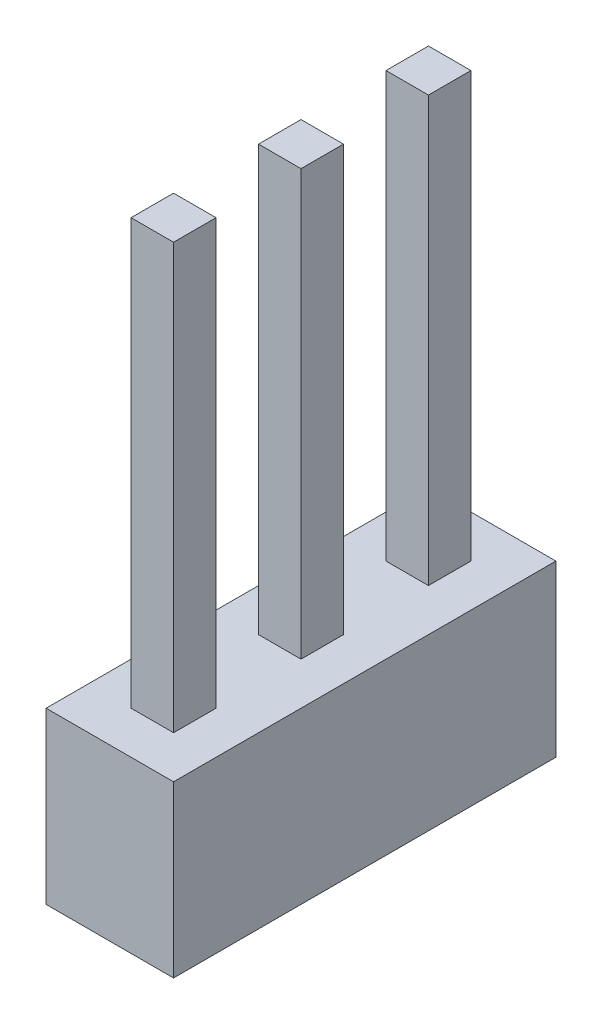
ISO-10303-21;
HEADER;
FILE_DESCRIPTION(('STEP AP214'),'2;1');
FILE_NAME('part.step','',(''),(''),'','','');
FILE_SCHEMA(('AUTOMOTIVE_DESIGN { 1 0 10303 214 1 1 1 1 }'));
ENDSEC;
DATA;
#1=APPLICATION_CONTEXT('core data for automotive mechanical design processes');
#2=APPLICATION_PROTOCOL_DEFINITION('international standard','automotive_design',2000,#1);
#3=PRODUCT_CONTEXT('',#1,'mechanical');
#4=PRODUCT('Part','Part','',(#3));
#5=PRODUCT_RELATED_PRODUCT_CATEGORY('part','',(#4));
#6=PRODUCT_DEFINITION_FORMATION('','',#4);
#7=PRODUCT_DEFINITION_CONTEXT('part definition',#1,'design');
#8=PRODUCT_DEFINITION('design','',#6,#7);
#9=PRODUCT_DEFINITION_SHAPE('','',#8);
#10=(LENGTH_UNIT() NAMED_UNIT(*) SI_UNIT(.MILLI.,.METRE.));
#11=(NAMED_UNIT(*) PLANE_ANGLE_UNIT() SI_UNIT($,.RADIAN.));
#12=(NAMED_UNIT(*) SI_UNIT($,.STERADIAN.) SOLID_ANGLE_UNIT());
#13=UNCERTAINTY_MEASURE_WITH_UNIT(LENGTH_MEASURE(1.E-05),#10,'distance_accuracy_value','');
#14=(GEOMETRIC_REPRESENTATION_CONTEXT(3) GLOBAL_UNCERTAINTY_ASSIGNED_CONTEXT((#13)) GLOBAL_UNIT_ASSIGNED_CONTEXT((#10,
#11,#12)) REPRESENTATION_CONTEXT('',''));
#15=CARTESIAN_POINT('',(0.,0.,0.));
#16=DIRECTION('',(0.,0.,1.));
#17=DIRECTION('',(1.,0.,0.));
#18=AXIS2_PLACEMENT_3D('',#15,#16,#17);
#19=CARTESIAN_POINT('',(0.,3.048,-6.858));
#20=DIRECTION('',(0.,-1.,0.));
#21=DIRECTION('',(0.,0.,-1.));
#22=AXIS2_PLACEMENT_3D('',#19,#20,#21);
#23=PLANE('',#22);
#24=DIRECTION('',(0.,0.,1.));
#25=VECTOR('',#24,1.);
#26=CARTESIAN_POINT('',(0.761999999999999,3.048,-5.334));
#27=LINE('',#26,#25);
#28=CARTESIAN_POINT('',(0.761999999999999,3.048,-6.096));
#29=VERTEX_POINT('',#28);
#30=CARTESIAN_POINT('',(0.761999999999999,3.048,-5.334));
#31=VERTEX_POINT('',#30);
#32=EDGE_CURVE('E170',#29,#31,#27,.T.);
#33=ORIENTED_EDGE('',*,*,#32,.F.);
#34=DIRECTION('',(-1.,0.,0.));
#35=VECTOR('',#34,1.);
#36=CARTESIAN_POINT('',(0.761999999999999,3.048,-6.096));
#37=LINE('',#36,#35);
#38=CARTESIAN_POINT('',(1.524,3.048,-6.096));
#39=VERTEX_POINT('',#38);
#40=EDGE_CURVE('E183',#39,#29,#37,.T.);
#41=ORIENTED_EDGE('',*,*,#40,.F.);
#42=DIRECTION('',(0.,0.,-1.));
#43=VECTOR('',#42,1.);
#44=CARTESIAN_POINT('',(1.524,3.048,-5.334));
#45=LINE('',#44,#43);
#46=CARTESIAN_POINT('',(1.524,3.048,-5.334));
#47=VERTEX_POINT('',#46);
#48=EDGE_CURVE('E192',#47,#39,#45,.T.);
#49=ORIENTED_EDGE('',*,*,#48,.F.);
#50=DIRECTION('',(1.,0.,0.));
#51=VECTOR('',#50,1.);
#52=CARTESIAN_POINT('',(0.761999999999999,3.048,-5.334));
#53=LINE('',#52,#51);
#54=EDGE_CURVE('E173',#31,#47,#53,.T.);
#55=ORIENTED_EDGE('',*,*,#54,.F.);
#56=EDGE_LOOP('',(#33,#41,#49,#55));
#57=FACE_BOUND('',#56,.T.);
#58=DIRECTION('',(0.,0.,1.));
#59=VECTOR('',#58,1.);
#60=CARTESIAN_POINT('',(0.,3.048,0.));
#61=LINE('',#60,#59);
#62=CARTESIAN_POINT('',(0.,3.048,-6.858));
#63=VERTEX_POINT('',#62);
#64=CARTESIAN_POINT('',(0.,3.048,0.));
#65=VERTEX_POINT('',#64);
#66=EDGE_CURVE('E242',#63,#65,#61,.T.);
#67=ORIENTED_EDGE('',*,*,#66,.T.);
#68=DIRECTION('',(1.,0.,0.));
#69=VECTOR('',#68,1.);
#70=CARTESIAN_POINT('',(0.,3.048,0.));
#71=LINE('',#70,#69);
#72=CARTESIAN_POINT('',(2.286,3.048,0.));
#73=VERTEX_POINT('',#72);
#74=EDGE_CURVE('E245',#65,#73,#71,.T.);
#75=ORIENTED_EDGE('',*,*,#74,.T.);
#76=DIRECTION('',(0.,0.,-1.));
#77=VECTOR('',#76,1.);
#78=CARTESIAN_POINT('',(2.286,3.048,0.));
#79=LINE('',#78,#77);
#80=CARTESIAN_POINT('',(2.286,3.048,-6.858));
#81=VERTEX_POINT('',#80);
#82=EDGE_CURVE('E248',#73,#81,#79,.T.);
#83=ORIENTED_EDGE('',*,*,#82,.T.);
#84=DIRECTION('',(-1.,0.,0.));
#85=VECTOR('',#84,1.);
#86=CARTESIAN_POINT('',(0.,3.048,-6.858));
#87=LINE('',#86,#85);
#88=EDGE_CURVE('E250',#81,#63,#87,.T.);
#89=ORIENTED_EDGE('',*,*,#88,.T.);
#90=EDGE_LOOP('',(#67,#75,#83,#89));
#91=FACE_BOUND('',#90,.T.);
#92=DIRECTION('',(0.,0.,1.));
#93=VECTOR('',#92,1.);
#94=CARTESIAN_POINT('',(0.761999999999999,3.048,-0.762));
#95=LINE('',#94,#93);
#96=CARTESIAN_POINT('',(0.761999999999999,3.048,-1.524));
#97=VERTEX_POINT('',#96);
#98=CARTESIAN_POINT('',(0.761999999999999,3.048,-0.762));
#99=VERTEX_POINT('',#98);
#100=EDGE_CURVE('E208',#97,#99,#95,.T.);
#101=ORIENTED_EDGE('',*,*,#100,.F.);
#102=DIRECTION('',(-1.,0.,0.));
#103=VECTOR('',#102,1.);
#104=CARTESIAN_POINT('',(0.761999999999999,3.048,-1.524));
#105=LINE('',#104,#103);
#106=CARTESIAN_POINT('',(1.524,3.048,-1.524));
#107=VERTEX_POINT('',#106);
#108=EDGE_CURVE('E213',#107,#97,#105,.T.);
#109=ORIENTED_EDGE('',*,*,#108,.F.);
#110=DIRECTION('',(0.,0.,-1.));
#111=VECTOR('',#110,1.);
#112=CARTESIAN_POINT('',(1.524,3.048,-0.762));
#113=LINE('',#112,#111);
#114=CARTESIAN_POINT('',(1.524,3.048,-0.762));
#115=VERTEX_POINT('',#114);
#116=EDGE_CURVE('E225',#115,#107,#113,.T.);
#117=ORIENTED_EDGE('',*,*,#116,.F.);
#118=DIRECTION('',(1.,0.,0.));
#119=VECTOR('',#118,1.);
#120=CARTESIAN_POINT('',(0.761999999999999,3.048,-0.762));
#121=LINE('',#120,#119);
#122=EDGE_CURVE('E222',#99,#115,#121,.T.);
#123=ORIENTED_EDGE('',*,*,#122,.F.);
#124=EDGE_LOOP('',(#101,#109,#117,#123));
#125=FACE_BOUND('',#124,.T.);
#126=DIRECTION('',(0.,0.,1.));
#127=VECTOR('',#126,1.);
#128=CARTESIAN_POINT('',(0.761999999999998,3.048,-3.048));
#129=LINE('',#128,#127);
#130=CARTESIAN_POINT('',(0.761999999999998,3.048,-3.81));
#131=VERTEX_POINT('',#130);
#132=CARTESIAN_POINT('',(0.761999999999998,3.048,-3.048));
#133=VERTEX_POINT('',#132);
#134=EDGE_CURVE('E169',#131,#133,#129,.T.);
#135=ORIENTED_EDGE('',*,*,#134,.F.);
#136=DIRECTION('',(-1.,0.,0.));
#137=VECTOR('',#136,1.);
#138=CARTESIAN_POINT('',(0.761999999999998,3.048,-3.81));
#139=LINE('',#138,#137);
#140=CARTESIAN_POINT('',(1.524,3.048,-3.81));
#141=VERTEX_POINT('',#140);
#142=EDGE_CURVE('E166',#141,#131,#139,.T.);
#143=ORIENTED_EDGE('',*,*,#142,.F.);
#144=DIRECTION('',(0.,0.,-1.));
#145=VECTOR('',#144,1.);
#146=CARTESIAN_POINT('',(1.524,3.048,-3.048));
#147=LINE('',#146,#145);
#148=CARTESIAN_POINT('',(1.524,3.048,-3.048));
#149=VERTEX_POINT('',#148);
#150=EDGE_CURVE('E56',#149,#141,#147,.T.);
#151=ORIENTED_EDGE('',*,*,#150,.F.);
#152=DIRECTION('',(1.,0.,0.));
#153=VECTOR('',#152,1.);
#154=CARTESIAN_POINT('',(0.761999999999998,3.048,-3.048));
#155=LINE('',#154,#153);
#156=EDGE_CURVE('E51',#133,#149,#155,.T.);
#157=ORIENTED_EDGE('',*,*,#156,.F.);
#158=EDGE_LOOP('',(#135,#143,#151,#157));
#159=FACE_BOUND('',#158,.T.);
#160=ADVANCED_FACE('F36',(#57,#91,#125,#159),#23,.F.);
#161=CARTESIAN_POINT('',(0.,3.048,0.));
#162=DIRECTION('',(1.,0.,0.));
#163=DIRECTION('',(0.,0.,-1.));
#164=AXIS2_PLACEMENT_3D('',#161,#162,#163);
#165=PLANE('',#164);
#166=DIRECTION('',(0.,0.,1.));
#167=VECTOR('',#166,1.);
#168=CARTESIAN_POINT('',(0.,0.,0.));
#169=LINE('',#168,#167);
#170=CARTESIAN_POINT('',(0.,0.,-6.858));
#171=VERTEX_POINT('',#170);
#172=CARTESIAN_POINT('',(0.,0.,0.));
#173=VERTEX_POINT('',#172);
#174=EDGE_CURVE('E241',#171,#173,#169,.T.);
#175=ORIENTED_EDGE('',*,*,#174,.T.);
#176=DIRECTION('',(0.,-1.,0.));
#177=VECTOR('',#176,1.);
#178=CARTESIAN_POINT('',(0.,3.048,0.));
#179=LINE('',#178,#177);
#180=EDGE_CURVE('E11',#65,#173,#179,.T.);
#181=ORIENTED_EDGE('',*,*,#180,.F.);
#182=ORIENTED_EDGE('',*,*,#66,.F.);
#183=DIRECTION('',(0.,-1.,0.));
#184=VECTOR('',#183,1.);
#185=CARTESIAN_POINT('',(0.,3.048,-6.858));
#186=LINE('',#185,#184);
#187=EDGE_CURVE('E252',#63,#171,#186,.T.);
#188=ORIENTED_EDGE('',*,*,#187,.T.);
#189=EDGE_LOOP('',(#175,#181,#182,#188));
#190=FACE_BOUND('',#189,.T.);
#191=ADVANCED_FACE('F38',(#190),#165,.F.);
#192=CARTESIAN_POINT('',(0.,3.048,0.));
#193=DIRECTION('',(0.,0.,-1.));
#194=DIRECTION('',(-1.,0.,0.));
#195=AXIS2_PLACEMENT_3D('',#192,#193,#194);
#196=PLANE('',#195);
#197=DIRECTION('',(1.,0.,0.));
#198=VECTOR('',#197,1.);
#199=CARTESIAN_POINT('',(0.,0.,0.));
#200=LINE('',#199,#198);
#201=CARTESIAN_POINT('',(2.286,0.,0.));
#202=VERTEX_POINT('',#201);
#203=EDGE_CURVE('E255',#173,#202,#200,.T.);
#204=ORIENTED_EDGE('',*,*,#203,.T.);
#205=DIRECTION('',(0.,-1.,0.));
#206=VECTOR('',#205,1.);
#207=CARTESIAN_POINT('',(2.286,3.048,0.));
#208=LINE('',#207,#206);
#209=EDGE_CURVE('E44',#73,#202,#208,.T.);
#210=ORIENTED_EDGE('',*,*,#209,.F.);
#211=ORIENTED_EDGE('',*,*,#74,.F.);
#212=ORIENTED_EDGE('',*,*,#180,.T.);
#213=EDGE_LOOP('',(#204,#210,#211,#212));
#214=FACE_BOUND('',#213,.T.);
#215=ADVANCED_FACE('F285',(#214),#196,.F.);
#216=CARTESIAN_POINT('',(2.286,3.048,0.));
#217=DIRECTION('',(-1.,0.,0.));
#218=DIRECTION('',(0.,0.,1.));
#219=AXIS2_PLACEMENT_3D('',#216,#217,#218);
#220=PLANE('',#219);
#221=DIRECTION('',(0.,0.,-1.));
#222=VECTOR('',#221,1.);
#223=CARTESIAN_POINT('',(2.286,0.,0.));
#224=LINE('',#223,#222);
#225=CARTESIAN_POINT('',(2.286,0.,-6.858));
#226=VERTEX_POINT('',#225);
#227=EDGE_CURVE('E257',#202,#226,#224,.T.);
#228=ORIENTED_EDGE('',*,*,#227,.T.);
#229=DIRECTION('',(0.,-1.,0.));
#230=VECTOR('',#229,1.);
#231=CARTESIAN_POINT('',(2.286,3.048,-6.858));
#232=LINE('',#231,#230);
#233=EDGE_CURVE('E262',#81,#226,#232,.T.);
#234=ORIENTED_EDGE('',*,*,#233,.F.);
#235=ORIENTED_EDGE('',*,*,#82,.F.);
#236=ORIENTED_EDGE('',*,*,#209,.T.);
#237=EDGE_LOOP('',(#228,#234,#235,#236));
#238=FACE_BOUND('',#237,.T.);
#239=ADVANCED_FACE('F269',(#238),#220,.F.);
#240=CARTESIAN_POINT('',(0.,3.048,-6.858));
#241=DIRECTION('',(0.,0.,1.));
#242=DIRECTION('',(1.,0.,0.));
#243=AXIS2_PLACEMENT_3D('',#240,#241,#242);
#244=PLANE('',#243);
#245=DIRECTION('',(-1.,0.,0.));
#246=VECTOR('',#245,1.);
#247=CARTESIAN_POINT('',(0.,0.,-6.858));
#248=LINE('',#247,#246);
#249=EDGE_CURVE('E246',#226,#171,#248,.T.);
#250=ORIENTED_EDGE('',*,*,#249,.T.);
#251=ORIENTED_EDGE('',*,*,#187,.F.);
#252=ORIENTED_EDGE('',*,*,#88,.F.);
#253=ORIENTED_EDGE('',*,*,#233,.T.);
#254=EDGE_LOOP('',(#250,#251,#252,#253));
#255=FACE_BOUND('',#254,.T.);
#256=ADVANCED_FACE('F278',(#255),#244,.F.);
#257=CARTESIAN_POINT('',(0.,0.,-6.858));
#258=DIRECTION('',(0.,-1.,0.));
#259=DIRECTION('',(0.,0.,-1.));
#260=AXIS2_PLACEMENT_3D('',#257,#258,#259);
#261=PLANE('',#260);
#262=ORIENTED_EDGE('',*,*,#174,.F.);
#263=ORIENTED_EDGE('',*,*,#249,.F.);
#264=ORIENTED_EDGE('',*,*,#227,.F.);
#265=ORIENTED_EDGE('',*,*,#203,.F.);
#266=EDGE_LOOP('',(#262,#263,#264,#265));
#267=FACE_BOUND('',#266,.T.);
#268=ADVANCED_FACE('F275',(#267),#261,.T.);
#269=CARTESIAN_POINT('',(0.761999999999999,10.668,-0.762));
#270=DIRECTION('',(1.,0.,0.));
#271=DIRECTION('',(0.,0.,-1.));
#272=AXIS2_PLACEMENT_3D('',#269,#270,#271);
#273=PLANE('',#272);
#274=ORIENTED_EDGE('',*,*,#100,.T.);
#275=DIRECTION('',(0.,-1.,0.));
#276=VECTOR('',#275,1.);
#277=CARTESIAN_POINT('',(0.761999999999999,10.668,-0.762));
#278=LINE('',#277,#276);
#279=CARTESIAN_POINT('',(0.761999999999999,10.668,-0.762));
#280=VERTEX_POINT('',#279);
#281=EDGE_CURVE('E238',#280,#99,#278,.T.);
#282=ORIENTED_EDGE('',*,*,#281,.F.);
#283=DIRECTION('',(0.,0.,1.));
#284=VECTOR('',#283,1.);
#285=CARTESIAN_POINT('',(0.761999999999999,10.668,-0.762));
#286=LINE('',#285,#284);
#287=CARTESIAN_POINT('',(0.761999999999999,10.668,-1.524));
#288=VERTEX_POINT('',#287);
#289=EDGE_CURVE('E209',#288,#280,#286,.T.);
#290=ORIENTED_EDGE('',*,*,#289,.F.);
#291=DIRECTION('',(0.,-1.,0.));
#292=VECTOR('',#291,1.);
#293=CARTESIAN_POINT('',(0.761999999999999,10.668,-1.524));
#294=LINE('',#293,#292);
#295=EDGE_CURVE('E219',#288,#97,#294,.T.);
#296=ORIENTED_EDGE('',*,*,#295,.T.);
#297=EDGE_LOOP('',(#274,#282,#290,#296));
#298=FACE_BOUND('',#297,.T.);
#299=ADVANCED_FACE('F299',(#298),#273,.F.);
#300=CARTESIAN_POINT('',(0.761999999999999,10.668,-0.762));
#301=DIRECTION('',(0.,0.,-1.));
#302=DIRECTION('',(-1.,0.,0.));
#303=AXIS2_PLACEMENT_3D('',#300,#301,#302);
#304=PLANE('',#303);
#305=ORIENTED_EDGE('',*,*,#122,.T.);
#306=DIRECTION('',(0.,-1.,0.));
#307=VECTOR('',#306,1.);
#308=CARTESIAN_POINT('',(1.524,10.668,-0.762));
#309=LINE('',#308,#307);
#310=CARTESIAN_POINT('',(1.524,10.668,-0.762));
#311=VERTEX_POINT('',#310);
#312=EDGE_CURVE('E235',#311,#115,#309,.T.);
#313=ORIENTED_EDGE('',*,*,#312,.F.);
#314=DIRECTION('',(1.,0.,0.));
#315=VECTOR('',#314,1.);
#316=CARTESIAN_POINT('',(0.761999999999999,10.668,-0.762));
#317=LINE('',#316,#315);
#318=EDGE_CURVE('E212',#280,#311,#317,.T.);
#319=ORIENTED_EDGE('',*,*,#318,.F.);
#320=ORIENTED_EDGE('',*,*,#281,.T.);
#321=EDGE_LOOP('',(#305,#313,#319,#320));
#322=FACE_BOUND('',#321,.T.);
#323=ADVANCED_FACE('F318',(#322),#304,.F.);
#324=CARTESIAN_POINT('',(1.524,10.668,-0.762));
#325=DIRECTION('',(-1.,0.,0.));
#326=DIRECTION('',(0.,0.,1.));
#327=AXIS2_PLACEMENT_3D('',#324,#325,#326);
#328=PLANE('',#327);
#329=ORIENTED_EDGE('',*,*,#116,.T.);
#330=DIRECTION('',(0.,-1.,0.));
#331=VECTOR('',#330,1.);
#332=CARTESIAN_POINT('',(1.524,10.668,-1.524));
#333=LINE('',#332,#331);
#334=CARTESIAN_POINT('',(1.524,10.668,-1.524));
#335=VERTEX_POINT('',#334);
#336=EDGE_CURVE('E232',#335,#107,#333,.T.);
#337=ORIENTED_EDGE('',*,*,#336,.F.);
#338=DIRECTION('',(0.,0.,-1.));
#339=VECTOR('',#338,1.);
#340=CARTESIAN_POINT('',(1.524,10.668,-0.762));
#341=LINE('',#340,#339);
#342=EDGE_CURVE('E215',#311,#335,#341,.T.);
#343=ORIENTED_EDGE('',*,*,#342,.F.);
#344=ORIENTED_EDGE('',*,*,#312,.T.);
#345=EDGE_LOOP('',(#329,#337,#343,#344));
#346=FACE_BOUND('',#345,.T.);
#347=ADVANCED_FACE('F325',(#346),#328,.F.);
#348=CARTESIAN_POINT('',(0.761999999999999,10.668,-1.524));
#349=DIRECTION('',(0.,0.,1.));
#350=DIRECTION('',(1.,0.,0.));
#351=AXIS2_PLACEMENT_3D('',#348,#349,#350);
#352=PLANE('',#351);
#353=ORIENTED_EDGE('',*,*,#108,.T.);
#354=ORIENTED_EDGE('',*,*,#295,.F.);
#355=DIRECTION('',(-1.,0.,0.));
#356=VECTOR('',#355,1.);
#357=CARTESIAN_POINT('',(0.761999999999999,10.668,-1.524));
#358=LINE('',#357,#356);
#359=EDGE_CURVE('E217',#335,#288,#358,.T.);
#360=ORIENTED_EDGE('',*,*,#359,.F.);
#361=ORIENTED_EDGE('',*,*,#336,.T.);
#362=EDGE_LOOP('',(#353,#354,#360,#361));
#363=FACE_BOUND('',#362,.T.);
#364=ADVANCED_FACE('F332',(#363),#352,.F.);
#365=CARTESIAN_POINT('',(0.761999999999999,10.668,-1.524));
#366=DIRECTION('',(0.,-1.,0.));
#367=DIRECTION('',(0.,0.,-1.));
#368=AXIS2_PLACEMENT_3D('',#365,#366,#367);
#369=PLANE('',#368);
#370=ORIENTED_EDGE('',*,*,#289,.T.);
#371=ORIENTED_EDGE('',*,*,#318,.T.);
#372=ORIENTED_EDGE('',*,*,#342,.T.);
#373=ORIENTED_EDGE('',*,*,#359,.T.);
#374=EDGE_LOOP('',(#370,#371,#372,#373));
#375=FACE_BOUND('',#374,.T.);
#376=ADVANCED_FACE('F340',(#375),#369,.F.);
#377=CARTESIAN_POINT('',(0.761999999999999,10.668,-5.334));
#378=DIRECTION('',(1.,0.,0.));
#379=DIRECTION('',(0.,0.,-1.));
#380=AXIS2_PLACEMENT_3D('',#377,#378,#379);
#381=PLANE('',#380);
#382=ORIENTED_EDGE('',*,*,#32,.T.);
#383=DIRECTION('',(0.,-1.,0.));
#384=VECTOR('',#383,1.);
#385=CARTESIAN_POINT('',(0.761999999999999,10.668,-5.334));
#386=LINE('',#385,#384);
#387=CARTESIAN_POINT('',(0.761999999999999,10.668,-5.334));
#388=VERTEX_POINT('',#387);
#389=EDGE_CURVE('E205',#388,#31,#386,.T.);
#390=ORIENTED_EDGE('',*,*,#389,.F.);
#391=DIRECTION('',(0.,0.,1.));
#392=VECTOR('',#391,1.);
#393=CARTESIAN_POINT('',(0.761999999999999,10.668,-5.334));
#394=LINE('',#393,#392);
#395=CARTESIAN_POINT('',(0.761999999999999,10.668,-6.096));
#396=VERTEX_POINT('',#395);
#397=EDGE_CURVE('E179',#396,#388,#394,.T.);
#398=ORIENTED_EDGE('',*,*,#397,.F.);
#399=DIRECTION('',(0.,-1.,0.));
#400=VECTOR('',#399,1.);
#401=CARTESIAN_POINT('',(0.761999999999999,10.668,-6.096));
#402=LINE('',#401,#400);
#403=EDGE_CURVE('E188',#396,#29,#402,.T.);
#404=ORIENTED_EDGE('',*,*,#403,.T.);
#405=EDGE_LOOP('',(#382,#390,#398,#404));
#406=FACE_BOUND('',#405,.T.);
#407=ADVANCED_FACE('F348',(#406),#381,.F.);
#408=CARTESIAN_POINT('',(0.761999999999999,10.668,-5.334));
#409=DIRECTION('',(0.,0.,-1.));
#410=DIRECTION('',(-1.,0.,0.));
#411=AXIS2_PLACEMENT_3D('',#408,#409,#410);
#412=PLANE('',#411);
#413=ORIENTED_EDGE('',*,*,#54,.T.);
#414=DIRECTION('',(0.,-1.,0.));
#415=VECTOR('',#414,1.);
#416=CARTESIAN_POINT('',(1.524,10.668,-5.334));
#417=LINE('',#416,#415);
#418=CARTESIAN_POINT('',(1.524,10.668,-5.334));
#419=VERTEX_POINT('',#418);
#420=EDGE_CURVE('E202',#419,#47,#417,.T.);
#421=ORIENTED_EDGE('',*,*,#420,.F.);
#422=DIRECTION('',(1.,0.,0.));
#423=VECTOR('',#422,1.);
#424=CARTESIAN_POINT('',(0.761999999999999,10.668,-5.334));
#425=LINE('',#424,#423);
#426=EDGE_CURVE('E182',#388,#419,#425,.T.);
#427=ORIENTED_EDGE('',*,*,#426,.F.);
#428=ORIENTED_EDGE('',*,*,#389,.T.);
#429=EDGE_LOOP('',(#413,#421,#427,#428));
#430=FACE_BOUND('',#429,.T.);
#431=ADVANCED_FACE('F356',(#430),#412,.F.);
#432=CARTESIAN_POINT('',(1.524,10.668,-5.334));
#433=DIRECTION('',(-1.,0.,0.));
#434=DIRECTION('',(0.,0.,1.));
#435=AXIS2_PLACEMENT_3D('',#432,#433,#434);
#436=PLANE('',#435);
#437=ORIENTED_EDGE('',*,*,#48,.T.);
#438=DIRECTION('',(0.,-1.,0.));
#439=VECTOR('',#438,1.);
#440=CARTESIAN_POINT('',(1.524,10.668,-6.096));
#441=LINE('',#440,#439);
#442=CARTESIAN_POINT('',(1.524,10.668,-6.096));
#443=VERTEX_POINT('',#442);
#444=EDGE_CURVE('E199',#443,#39,#441,.T.);
#445=ORIENTED_EDGE('',*,*,#444,.F.);
#446=DIRECTION('',(0.,0.,-1.));
#447=VECTOR('',#446,1.);
#448=CARTESIAN_POINT('',(1.524,10.668,-5.334));
#449=LINE('',#448,#447);
#450=EDGE_CURVE('E185',#419,#443,#449,.T.);
#451=ORIENTED_EDGE('',*,*,#450,.F.);
#452=ORIENTED_EDGE('',*,*,#420,.T.);
#453=EDGE_LOOP('',(#437,#445,#451,#452));
#454=FACE_BOUND('',#453,.T.);
#455=ADVANCED_FACE('F364',(#454),#436,.F.);
#456=CARTESIAN_POINT('',(0.761999999999999,10.668,-6.096));
#457=DIRECTION('',(0.,0.,1.));
#458=DIRECTION('',(1.,0.,0.));
#459=AXIS2_PLACEMENT_3D('',#456,#457,#458);
#460=PLANE('',#459);
#461=ORIENTED_EDGE('',*,*,#40,.T.);
#462=ORIENTED_EDGE('',*,*,#403,.F.);
#463=DIRECTION('',(-1.,0.,0.));
#464=VECTOR('',#463,1.);
#465=CARTESIAN_POINT('',(0.761999999999999,10.668,-6.096));
#466=LINE('',#465,#464);
#467=EDGE_CURVE('E187',#443,#396,#466,.T.);
#468=ORIENTED_EDGE('',*,*,#467,.F.);
#469=ORIENTED_EDGE('',*,*,#444,.T.);
#470=EDGE_LOOP('',(#461,#462,#468,#469));
#471=FACE_BOUND('',#470,.T.);
#472=ADVANCED_FACE('F372',(#471),#460,.F.);
#473=CARTESIAN_POINT('',(0.761999999999999,10.668,-6.096));
#474=DIRECTION('',(0.,-1.,0.));
#475=DIRECTION('',(0.,0.,-1.));
#476=AXIS2_PLACEMENT_3D('',#473,#474,#475);
#477=PLANE('',#476);
#478=ORIENTED_EDGE('',*,*,#397,.T.);
#479=ORIENTED_EDGE('',*,*,#426,.T.);
#480=ORIENTED_EDGE('',*,*,#450,.T.);
#481=ORIENTED_EDGE('',*,*,#467,.T.);
#482=EDGE_LOOP('',(#478,#479,#480,#481));
#483=FACE_BOUND('',#482,.T.);
#484=ADVANCED_FACE('F380',(#483),#477,.F.);
#485=CARTESIAN_POINT('',(0.761999999999998,10.668,-3.048));
#486=DIRECTION('',(1.,0.,0.));
#487=DIRECTION('',(0.,0.,-1.));
#488=AXIS2_PLACEMENT_3D('',#485,#486,#487);
#489=PLANE('',#488);
#490=ORIENTED_EDGE('',*,*,#134,.T.);
#491=DIRECTION('',(0.,-1.,0.));
#492=VECTOR('',#491,1.);
#493=CARTESIAN_POINT('',(0.761999999999998,10.668,-3.048));
#494=LINE('',#493,#492);
#495=CARTESIAN_POINT('',(0.761999999999998,10.668,-3.048));
#496=VERTEX_POINT('',#495);
#497=EDGE_CURVE('E150',#496,#133,#494,.T.);
#498=ORIENTED_EDGE('',*,*,#497,.F.);
#499=DIRECTION('',(0.,0.,1.));
#500=VECTOR('',#499,1.);
#501=CARTESIAN_POINT('',(0.761999999999998,10.668,-3.048));
#502=LINE('',#501,#500);
#503=CARTESIAN_POINT('',(0.761999999999998,10.668,-3.81));
#504=VERTEX_POINT('',#503);
#505=EDGE_CURVE('E157',#504,#496,#502,.T.);
#506=ORIENTED_EDGE('',*,*,#505,.F.);
#507=DIRECTION('',(0.,-1.,0.));
#508=VECTOR('',#507,1.);
#509=CARTESIAN_POINT('',(0.761999999999998,10.668,-3.81));
#510=LINE('',#509,#508);
#511=EDGE_CURVE('E479',#504,#131,#510,.T.);
#512=ORIENTED_EDGE('',*,*,#511,.T.);
#513=EDGE_LOOP('',(#490,#498,#506,#512));
#514=FACE_BOUND('',#513,.T.);
#515=ADVANCED_FACE('F168',(#514),#489,.F.);
#516=CARTESIAN_POINT('',(0.761999999999998,10.668,-3.048));
#517=DIRECTION('',(0.,0.,-1.));
#518=DIRECTION('',(-1.,0.,0.));
#519=AXIS2_PLACEMENT_3D('',#516,#517,#518);
#520=PLANE('',#519);
#521=ORIENTED_EDGE('',*,*,#156,.T.);
#522=DIRECTION('',(0.,-1.,0.));
#523=VECTOR('',#522,1.);
#524=CARTESIAN_POINT('',(1.524,10.668,-3.048));
#525=LINE('',#524,#523);
#526=CARTESIAN_POINT('',(1.524,10.668,-3.048));
#527=VERTEX_POINT('',#526);
#528=EDGE_CURVE('E153',#527,#149,#525,.T.);
#529=ORIENTED_EDGE('',*,*,#528,.F.);
#530=DIRECTION('',(1.,0.,0.));
#531=VECTOR('',#530,1.);
#532=CARTESIAN_POINT('',(0.761999999999998,10.668,-3.048));
#533=LINE('',#532,#531);
#534=EDGE_CURVE('E146',#496,#527,#533,.T.);
#535=ORIENTED_EDGE('',*,*,#534,.F.);
#536=ORIENTED_EDGE('',*,*,#497,.T.);
#537=EDGE_LOOP('',(#521,#529,#535,#536));
#538=FACE_BOUND('',#537,.T.);
#539=ADVANCED_FACE('F148',(#538),#520,.F.);
#540=CARTESIAN_POINT('',(1.524,10.668,-3.048));
#541=DIRECTION('',(-1.,0.,0.));
#542=DIRECTION('',(0.,0.,1.));
#543=AXIS2_PLACEMENT_3D('',#540,#541,#542);
#544=PLANE('',#543);
#545=ORIENTED_EDGE('',*,*,#150,.T.);
#546=DIRECTION('',(0.,-1.,0.));
#547=VECTOR('',#546,1.);
#548=CARTESIAN_POINT('',(1.524,10.668,-3.81));
#549=LINE('',#548,#547);
#550=CARTESIAN_POINT('',(1.524,10.668,-3.81));
#551=VERTEX_POINT('',#550);
#552=EDGE_CURVE('E175',#551,#141,#549,.T.);
#553=ORIENTED_EDGE('',*,*,#552,.F.);
#554=DIRECTION('',(0.,0.,-1.));
#555=VECTOR('',#554,1.);
#556=CARTESIAN_POINT('',(1.524,10.668,-3.048));
#557=LINE('',#556,#555);
#558=EDGE_CURVE('E156',#527,#551,#557,.T.);
#559=ORIENTED_EDGE('',*,*,#558,.F.);
#560=ORIENTED_EDGE('',*,*,#528,.T.);
#561=EDGE_LOOP('',(#545,#553,#559,#560));
#562=FACE_BOUND('',#561,.T.);
#563=ADVANCED_FACE('F401',(#562),#544,.F.);
#564=CARTESIAN_POINT('',(0.761999999999998,10.668,-3.81));
#565=DIRECTION('',(0.,0.,1.));
#566=DIRECTION('',(1.,0.,0.));
#567=AXIS2_PLACEMENT_3D('',#564,#565,#566);
#568=PLANE('',#567);
#569=ORIENTED_EDGE('',*,*,#142,.T.);
#570=ORIENTED_EDGE('',*,*,#511,.F.);
#571=DIRECTION('',(-1.,0.,0.));
#572=VECTOR('',#571,1.);
#573=CARTESIAN_POINT('',(0.761999999999998,10.668,-3.81));
#574=LINE('',#573,#572);
#575=EDGE_CURVE('E162',#551,#504,#574,.T.);
#576=ORIENTED_EDGE('',*,*,#575,.F.);
#577=ORIENTED_EDGE('',*,*,#552,.T.);
#578=EDGE_LOOP('',(#569,#570,#576,#577));
#579=FACE_BOUND('',#578,.T.);
#580=ADVANCED_FACE('F408',(#579),#568,.F.);
#581=CARTESIAN_POINT('',(0.761999999999998,10.668,-3.81));
#582=DIRECTION('',(0.,-1.,0.));
#583=DIRECTION('',(0.,0.,-1.));
#584=AXIS2_PLACEMENT_3D('',#581,#582,#583);
#585=PLANE('',#584);
#586=ORIENTED_EDGE('',*,*,#505,.T.);
#587=ORIENTED_EDGE('',*,*,#534,.T.);
#588=ORIENTED_EDGE('',*,*,#558,.T.);
#589=ORIENTED_EDGE('',*,*,#575,.T.);
#590=EDGE_LOOP('',(#586,#587,#588,#589));
#591=FACE_BOUND('',#590,.T.);
#592=ADVANCED_FACE('F160',(#591),#585,.F.);
#593=CLOSED_SHELL('',(#160,#191,#215,#239,#256,#268,#299,#323,#347,#364,#376,#407,#431,#455,
#472,#484,#515,#539,#563,#580,#592));
#594=MANIFOLD_SOLID_BREP('B2',#593);
#595=ADVANCED_BREP_SHAPE_REPRESENTATION('',(#18,#594),#14);
#596=SHAPE_DEFINITION_REPRESENTATION(#9,#595);
ENDSEC;
END-ISO-10303-21;
